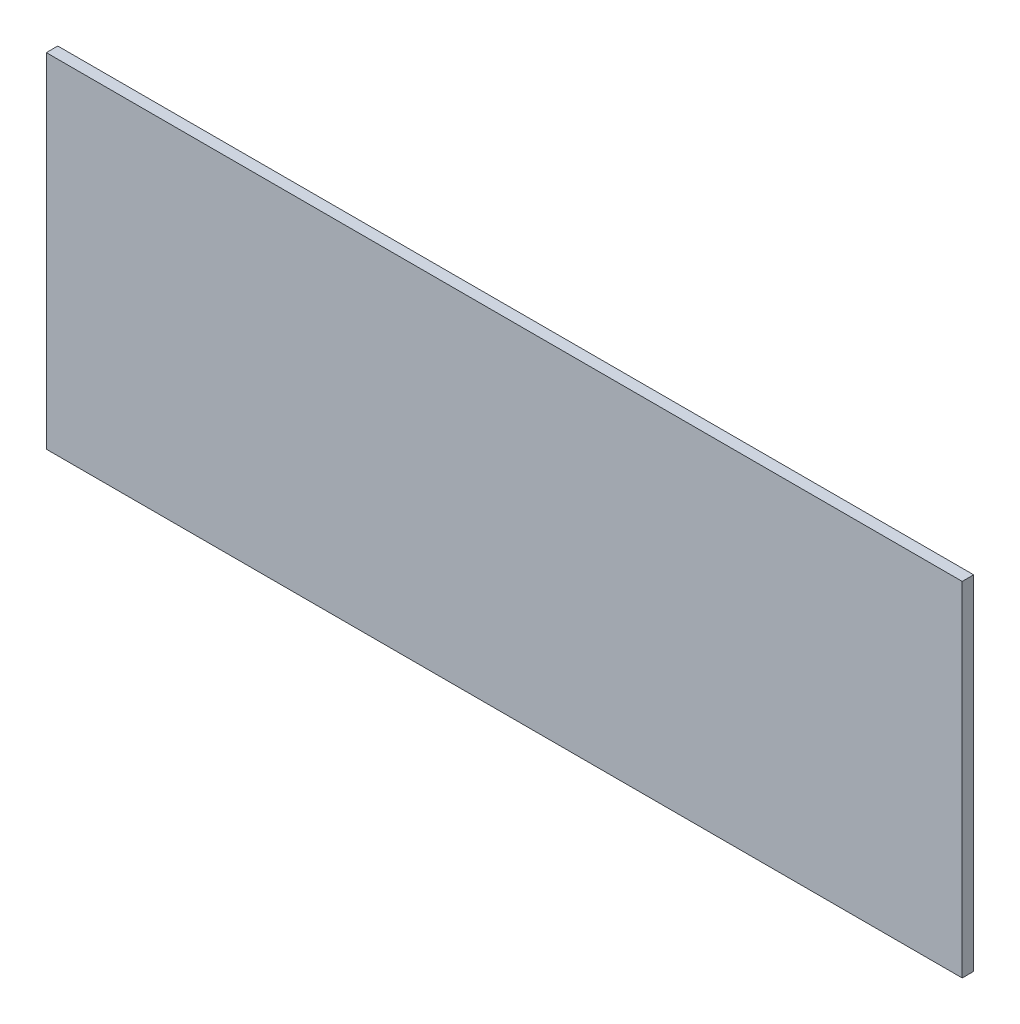
ISO-10303-21;
HEADER;
FILE_DESCRIPTION(('STEP AP214'),'2;1');
FILE_NAME('part.step','',(''),(''),'','','');
FILE_SCHEMA(('AUTOMOTIVE_DESIGN { 1 0 10303 214 1 1 1 1 }'));
ENDSEC;
DATA;
#1=APPLICATION_CONTEXT('core data for automotive mechanical design processes');
#2=APPLICATION_PROTOCOL_DEFINITION('international standard','automotive_design',2000,#1);
#3=PRODUCT_CONTEXT('',#1,'mechanical');
#4=PRODUCT('Part','Part','',(#3));
#5=PRODUCT_RELATED_PRODUCT_CATEGORY('part','',(#4));
#6=PRODUCT_DEFINITION_FORMATION('','',#4);
#7=PRODUCT_DEFINITION_CONTEXT('part definition',#1,'design');
#8=PRODUCT_DEFINITION('design','',#6,#7);
#9=PRODUCT_DEFINITION_SHAPE('','',#8);
#10=(LENGTH_UNIT() NAMED_UNIT(*) SI_UNIT(.MILLI.,.METRE.));
#11=(NAMED_UNIT(*) PLANE_ANGLE_UNIT() SI_UNIT($,.RADIAN.));
#12=(NAMED_UNIT(*) SI_UNIT($,.STERADIAN.) SOLID_ANGLE_UNIT());
#13=UNCERTAINTY_MEASURE_WITH_UNIT(LENGTH_MEASURE(1.E-05),#10,'distance_accuracy_value','');
#14=(GEOMETRIC_REPRESENTATION_CONTEXT(3) GLOBAL_UNCERTAINTY_ASSIGNED_CONTEXT((#13)) GLOBAL_UNIT_ASSIGNED_CONTEXT((#10,
#11,#12)) REPRESENTATION_CONTEXT('',''));
#15=CARTESIAN_POINT('',(0.,0.,0.));
#16=DIRECTION('',(0.,0.,1.));
#17=DIRECTION('',(1.,0.,0.));
#18=AXIS2_PLACEMENT_3D('',#15,#16,#17);
#19=CARTESIAN_POINT('',(2000.,750.,50.));
#20=DIRECTION('',(-1.,0.,0.));
#21=DIRECTION('',(0.,0.,1.));
#22=AXIS2_PLACEMENT_3D('',#19,#20,#21);
#23=PLANE('',#22);
#24=DIRECTION('',(0.,1.,0.));
#25=VECTOR('',#24,1.);
#26=CARTESIAN_POINT('',(2000.,750.,0.));
#27=LINE('',#26,#25);
#28=CARTESIAN_POINT('',(2000.,-750.,0.));
#29=VERTEX_POINT('',#28);
#30=CARTESIAN_POINT('',(2000.,750.,0.));
#31=VERTEX_POINT('',#30);
#32=EDGE_CURVE('E96',#29,#31,#27,.T.);
#33=ORIENTED_EDGE('',*,*,#32,.T.);
#34=DIRECTION('',(0.,0.,-1.));
#35=VECTOR('',#34,1.);
#36=CARTESIAN_POINT('',(2000.,750.,50.));
#37=LINE('',#36,#35);
#38=CARTESIAN_POINT('',(2000.,750.,50.));
#39=VERTEX_POINT('',#38);
#40=EDGE_CURVE('E11',#39,#31,#37,.T.);
#41=ORIENTED_EDGE('',*,*,#40,.F.);
#42=DIRECTION('',(0.,1.,0.));
#43=VECTOR('',#42,1.);
#44=CARTESIAN_POINT('',(2000.,750.,50.));
#45=LINE('',#44,#43);
#46=CARTESIAN_POINT('',(2000.,-750.,50.));
#47=VERTEX_POINT('',#46);
#48=EDGE_CURVE('E84',#47,#39,#45,.T.);
#49=ORIENTED_EDGE('',*,*,#48,.F.);
#50=DIRECTION('',(0.,0.,-1.));
#51=VECTOR('',#50,1.);
#52=CARTESIAN_POINT('',(2000.,-750.,50.));
#53=LINE('',#52,#51);
#54=EDGE_CURVE('E92',#47,#29,#53,.T.);
#55=ORIENTED_EDGE('',*,*,#54,.T.);
#56=EDGE_LOOP('',(#33,#41,#49,#55));
#57=FACE_BOUND('',#56,.T.);
#58=ADVANCED_FACE('F33',(#57),#23,.F.);
#59=CARTESIAN_POINT('',(-2000.,750.,50.));
#60=DIRECTION('',(0.,-1.,0.));
#61=DIRECTION('',(0.,0.,-1.));
#62=AXIS2_PLACEMENT_3D('',#59,#60,#61);
#63=PLANE('',#62);
#64=DIRECTION('',(-1.,0.,0.));
#65=VECTOR('',#64,1.);
#66=CARTESIAN_POINT('',(-2000.,750.,0.));
#67=LINE('',#66,#65);
#68=CARTESIAN_POINT('',(-2000.,750.,0.));
#69=VERTEX_POINT('',#68);
#70=EDGE_CURVE('E88',#31,#69,#67,.T.);
#71=ORIENTED_EDGE('',*,*,#70,.T.);
#72=DIRECTION('',(0.,0.,-1.));
#73=VECTOR('',#72,1.);
#74=CARTESIAN_POINT('',(-2000.,750.,50.));
#75=LINE('',#74,#73);
#76=CARTESIAN_POINT('',(-2000.,750.,50.));
#77=VERTEX_POINT('',#76);
#78=EDGE_CURVE('E41',#77,#69,#75,.T.);
#79=ORIENTED_EDGE('',*,*,#78,.F.);
#80=DIRECTION('',(-1.,0.,0.));
#81=VECTOR('',#80,1.);
#82=CARTESIAN_POINT('',(-2000.,750.,50.));
#83=LINE('',#82,#81);
#84=EDGE_CURVE('E79',#39,#77,#83,.T.);
#85=ORIENTED_EDGE('',*,*,#84,.F.);
#86=ORIENTED_EDGE('',*,*,#40,.T.);
#87=EDGE_LOOP('',(#71,#79,#85,#86));
#88=FACE_BOUND('',#87,.T.);
#89=ADVANCED_FACE('F87',(#88),#63,.F.);
#90=CARTESIAN_POINT('',(-2000.,750.,50.));
#91=DIRECTION('',(1.,0.,0.));
#92=DIRECTION('',(0.,0.,-1.));
#93=AXIS2_PLACEMENT_3D('',#90,#91,#92);
#94=PLANE('',#93);
#95=DIRECTION('',(0.,-1.,0.));
#96=VECTOR('',#95,1.);
#97=CARTESIAN_POINT('',(-2000.,750.,0.));
#98=LINE('',#97,#96);
#99=CARTESIAN_POINT('',(-2000.,-750.,0.));
#100=VERTEX_POINT('',#99);
#101=EDGE_CURVE('E66',#69,#100,#98,.T.);
#102=ORIENTED_EDGE('',*,*,#101,.T.);
#103=DIRECTION('',(0.,0.,-1.));
#104=VECTOR('',#103,1.);
#105=CARTESIAN_POINT('',(-2000.,-750.,50.));
#106=LINE('',#105,#104);
#107=CARTESIAN_POINT('',(-2000.,-750.,50.));
#108=VERTEX_POINT('',#107);
#109=EDGE_CURVE('E89',#108,#100,#106,.T.);
#110=ORIENTED_EDGE('',*,*,#109,.F.);
#111=DIRECTION('',(0.,-1.,0.));
#112=VECTOR('',#111,1.);
#113=CARTESIAN_POINT('',(-2000.,750.,50.));
#114=LINE('',#113,#112);
#115=EDGE_CURVE('E82',#77,#108,#114,.T.);
#116=ORIENTED_EDGE('',*,*,#115,.F.);
#117=ORIENTED_EDGE('',*,*,#78,.T.);
#118=EDGE_LOOP('',(#102,#110,#116,#117));
#119=FACE_BOUND('',#118,.T.);
#120=ADVANCED_FACE('F90',(#119),#94,.F.);
#121=CARTESIAN_POINT('',(-2000.,-750.,50.));
#122=DIRECTION('',(0.,1.,0.));
#123=DIRECTION('',(0.,0.,1.));
#124=AXIS2_PLACEMENT_3D('',#121,#122,#123);
#125=PLANE('',#124);
#126=DIRECTION('',(1.,0.,0.));
#127=VECTOR('',#126,1.);
#128=CARTESIAN_POINT('',(-2000.,-750.,0.));
#129=LINE('',#128,#127);
#130=EDGE_CURVE('E72',#100,#29,#129,.T.);
#131=ORIENTED_EDGE('',*,*,#130,.T.);
#132=ORIENTED_EDGE('',*,*,#54,.F.);
#133=DIRECTION('',(1.,0.,0.));
#134=VECTOR('',#133,1.);
#135=CARTESIAN_POINT('',(-2000.,-750.,50.));
#136=LINE('',#135,#134);
#137=EDGE_CURVE('E49',#108,#47,#136,.T.);
#138=ORIENTED_EDGE('',*,*,#137,.F.);
#139=ORIENTED_EDGE('',*,*,#109,.T.);
#140=EDGE_LOOP('',(#131,#132,#138,#139));
#141=FACE_BOUND('',#140,.T.);
#142=ADVANCED_FACE('F103',(#141),#125,.F.);
#143=CARTESIAN_POINT('',(0.,0.,50.));
#144=DIRECTION('',(0.,0.,1.));
#145=DIRECTION('',(1.,0.,0.));
#146=AXIS2_PLACEMENT_3D('',#143,#144,#145);
#147=PLANE('',#146);
#148=ORIENTED_EDGE('',*,*,#48,.T.);
#149=ORIENTED_EDGE('',*,*,#84,.T.);
#150=ORIENTED_EDGE('',*,*,#115,.T.);
#151=ORIENTED_EDGE('',*,*,#137,.T.);
#152=EDGE_LOOP('',(#148,#149,#150,#151));
#153=FACE_BOUND('',#152,.T.);
#154=ADVANCED_FACE('F80',(#153),#147,.T.);
#155=CARTESIAN_POINT('',(0.,0.,0.));
#156=DIRECTION('',(0.,0.,1.));
#157=DIRECTION('',(1.,0.,0.));
#158=AXIS2_PLACEMENT_3D('',#155,#156,#157);
#159=PLANE('',#158);
#160=ORIENTED_EDGE('',*,*,#32,.F.);
#161=ORIENTED_EDGE('',*,*,#130,.F.);
#162=ORIENTED_EDGE('',*,*,#101,.F.);
#163=ORIENTED_EDGE('',*,*,#70,.F.);
#164=EDGE_LOOP('',(#160,#161,#162,#163));
#165=FACE_BOUND('',#164,.T.);
#166=ADVANCED_FACE('F106',(#165),#159,.F.);
#167=CLOSED_SHELL('',(#58,#89,#120,#142,#154,#166));
#168=MANIFOLD_SOLID_BREP('B2',#167);
#169=ADVANCED_BREP_SHAPE_REPRESENTATION('',(#18,#168),#14);
#170=SHAPE_DEFINITION_REPRESENTATION(#9,#169);
ENDSEC;
END-ISO-10303-21;
